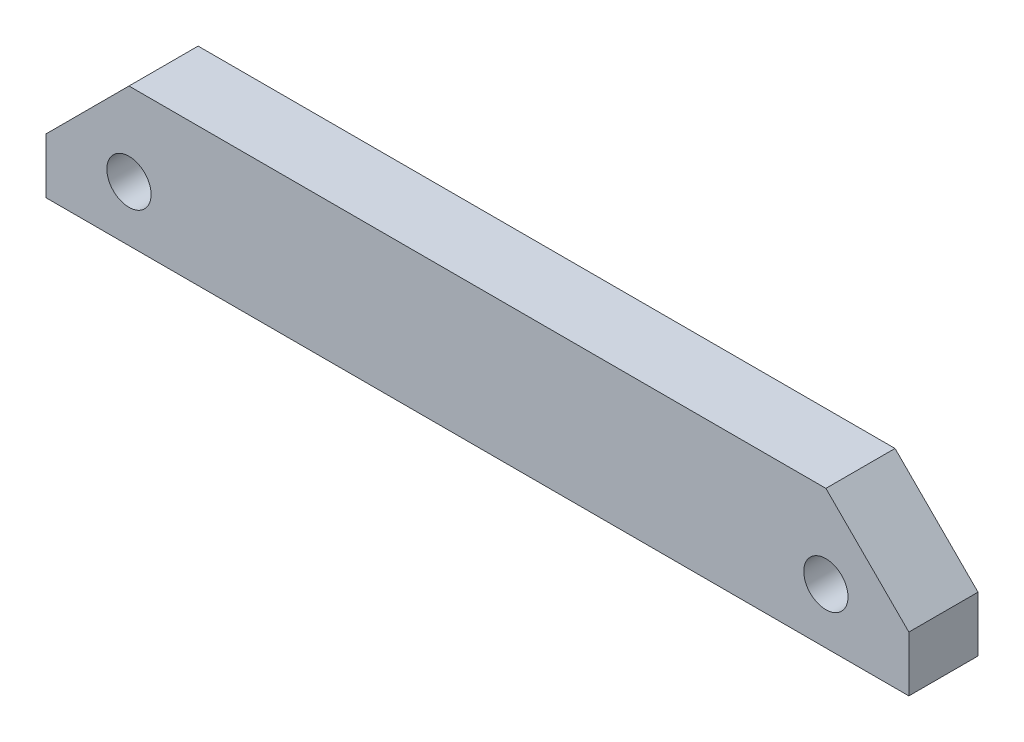
ISO-10303-21;
HEADER;
FILE_DESCRIPTION(('STEP AP214'),'2;1');
FILE_NAME('part.step','',(''),(''),'','','');
FILE_SCHEMA(('AUTOMOTIVE_DESIGN { 1 0 10303 214 1 1 1 1 }'));
ENDSEC;
DATA;
#1=APPLICATION_CONTEXT('core data for automotive mechanical design processes');
#2=APPLICATION_PROTOCOL_DEFINITION('international standard','automotive_design',2000,#1);
#3=PRODUCT_CONTEXT('',#1,'mechanical');
#4=PRODUCT('Part','Part','',(#3));
#5=PRODUCT_RELATED_PRODUCT_CATEGORY('part','',(#4));
#6=PRODUCT_DEFINITION_FORMATION('','',#4);
#7=PRODUCT_DEFINITION_CONTEXT('part definition',#1,'design');
#8=PRODUCT_DEFINITION('design','',#6,#7);
#9=PRODUCT_DEFINITION_SHAPE('','',#8);
#10=(LENGTH_UNIT() NAMED_UNIT(*) SI_UNIT(.MILLI.,.METRE.));
#11=(NAMED_UNIT(*) PLANE_ANGLE_UNIT() SI_UNIT($,.RADIAN.));
#12=(NAMED_UNIT(*) SI_UNIT($,.STERADIAN.) SOLID_ANGLE_UNIT());
#13=UNCERTAINTY_MEASURE_WITH_UNIT(LENGTH_MEASURE(1.E-05),#10,'distance_accuracy_value','');
#14=(GEOMETRIC_REPRESENTATION_CONTEXT(3) GLOBAL_UNCERTAINTY_ASSIGNED_CONTEXT((#13)) GLOBAL_UNIT_ASSIGNED_CONTEXT((#10,
#11,#12)) REPRESENTATION_CONTEXT('',''));
#15=CARTESIAN_POINT('',(0.,0.,0.));
#16=DIRECTION('',(0.,0.,1.));
#17=DIRECTION('',(1.,0.,0.));
#18=AXIS2_PLACEMENT_3D('',#15,#16,#17);
#19=CARTESIAN_POINT('',(31.2,0.,5.));
#20=DIRECTION('',(-1.,0.,0.));
#21=DIRECTION('',(0.,0.,1.));
#22=AXIS2_PLACEMENT_3D('',#19,#20,#21);
#23=PLANE('',#22);
#24=DIRECTION('',(0.,1.,0.));
#25=VECTOR('',#24,1.);
#26=CARTESIAN_POINT('',(31.2,0.,0.));
#27=LINE('',#26,#25);
#28=CARTESIAN_POINT('',(31.2,0.,0.));
#29=VERTEX_POINT('',#28);
#30=CARTESIAN_POINT('',(31.2,4.00000000000001,0.));
#31=VERTEX_POINT('',#30);
#32=EDGE_CURVE('E128',#29,#31,#27,.T.);
#33=ORIENTED_EDGE('',*,*,#32,.T.);
#34=DIRECTION('',(0.,0.,-1.));
#35=VECTOR('',#34,1.);
#36=CARTESIAN_POINT('',(31.2,4.00000000000001,5.));
#37=LINE('',#36,#35);
#38=CARTESIAN_POINT('',(31.2,4.00000000000001,5.));
#39=VERTEX_POINT('',#38);
#40=EDGE_CURVE('E11',#39,#31,#37,.T.);
#41=ORIENTED_EDGE('',*,*,#40,.F.);
#42=DIRECTION('',(0.,1.,0.));
#43=VECTOR('',#42,1.);
#44=CARTESIAN_POINT('',(31.2,0.,5.));
#45=LINE('',#44,#43);
#46=CARTESIAN_POINT('',(31.2,0.,5.));
#47=VERTEX_POINT('',#46);
#48=EDGE_CURVE('E145',#47,#39,#45,.T.);
#49=ORIENTED_EDGE('',*,*,#48,.F.);
#50=DIRECTION('',(0.,0.,-1.));
#51=VECTOR('',#50,1.);
#52=CARTESIAN_POINT('',(31.2,0.,5.));
#53=LINE('',#52,#51);
#54=EDGE_CURVE('E124',#47,#29,#53,.T.);
#55=ORIENTED_EDGE('',*,*,#54,.T.);
#56=EDGE_LOOP('',(#33,#41,#49,#55));
#57=FACE_BOUND('',#56,.T.);
#58=ADVANCED_FACE('F39',(#57),#23,.F.);
#59=CARTESIAN_POINT('',(31.2,4.00000000000001,5.));
#60=DIRECTION('',(-0.707106781186544,-0.707106781186551,0.));
#61=DIRECTION('',(0.707106781186551,-0.707106781186544,0.));
#62=AXIS2_PLACEMENT_3D('',#59,#60,#61);
#63=PLANE('',#62);
#64=DIRECTION('',(-0.707106781186551,0.707106781186544,0.));
#65=VECTOR('',#64,1.);
#66=CARTESIAN_POINT('',(31.2,4.00000000000001,0.));
#67=LINE('',#66,#65);
#68=CARTESIAN_POINT('',(25.1999999999999,10.,0.));
#69=VERTEX_POINT('',#68);
#70=EDGE_CURVE('E132',#31,#69,#67,.T.);
#71=ORIENTED_EDGE('',*,*,#70,.T.);
#72=DIRECTION('',(0.,0.,-1.));
#73=VECTOR('',#72,1.);
#74=CARTESIAN_POINT('',(25.1999999999999,10.,5.));
#75=LINE('',#74,#73);
#76=CARTESIAN_POINT('',(25.1999999999999,10.,5.));
#77=VERTEX_POINT('',#76);
#78=EDGE_CURVE('E48',#77,#69,#75,.T.);
#79=ORIENTED_EDGE('',*,*,#78,.F.);
#80=DIRECTION('',(-0.707106781186551,0.707106781186544,0.));
#81=VECTOR('',#80,1.);
#82=CARTESIAN_POINT('',(31.2,4.00000000000001,5.));
#83=LINE('',#82,#81);
#84=EDGE_CURVE('E93',#39,#77,#83,.T.);
#85=ORIENTED_EDGE('',*,*,#84,.F.);
#86=ORIENTED_EDGE('',*,*,#40,.T.);
#87=EDGE_LOOP('',(#71,#79,#85,#86));
#88=FACE_BOUND('',#87,.T.);
#89=ADVANCED_FACE('F174',(#88),#63,.F.);
#90=CARTESIAN_POINT('',(25.1999999999999,10.,5.));
#91=DIRECTION('',(0.,-1.,0.));
#92=DIRECTION('',(1.,0.,0.));
#93=AXIS2_PLACEMENT_3D('',#90,#91,#92);
#94=PLANE('',#93);
#95=DIRECTION('',(-1.,0.,0.));
#96=VECTOR('',#95,1.);
#97=CARTESIAN_POINT('',(25.1999999999999,10.,0.));
#98=LINE('',#97,#96);
#99=CARTESIAN_POINT('',(-25.2000000000001,9.99999999999999,0.));
#100=VERTEX_POINT('',#99);
#101=EDGE_CURVE('E136',#69,#100,#98,.T.);
#102=ORIENTED_EDGE('',*,*,#101,.T.);
#103=DIRECTION('',(0.,0.,-1.));
#104=VECTOR('',#103,1.);
#105=CARTESIAN_POINT('',(-25.2000000000001,9.99999999999999,5.));
#106=LINE('',#105,#104);
#107=CARTESIAN_POINT('',(-25.2000000000001,9.99999999999999,5.));
#108=VERTEX_POINT('',#107);
#109=EDGE_CURVE('E117',#108,#100,#106,.T.);
#110=ORIENTED_EDGE('',*,*,#109,.F.);
#111=DIRECTION('',(-1.,0.,0.));
#112=VECTOR('',#111,1.);
#113=CARTESIAN_POINT('',(25.1999999999999,10.,5.));
#114=LINE('',#113,#112);
#115=EDGE_CURVE('E106',#77,#108,#114,.T.);
#116=ORIENTED_EDGE('',*,*,#115,.F.);
#117=ORIENTED_EDGE('',*,*,#78,.T.);
#118=EDGE_LOOP('',(#102,#110,#116,#117));
#119=FACE_BOUND('',#118,.T.);
#120=ADVANCED_FACE('F155',(#119),#94,.F.);
#121=CARTESIAN_POINT('',(-31.2,4.,5.));
#122=DIRECTION('',(0.707106781186551,-0.707106781186544,0.));
#123=DIRECTION('',(0.707106781186544,0.707106781186551,0.));
#124=AXIS2_PLACEMENT_3D('',#121,#122,#123);
#125=PLANE('',#124);
#126=DIRECTION('',(-0.707106781186544,-0.707106781186551,0.));
#127=VECTOR('',#126,1.);
#128=CARTESIAN_POINT('',(-31.2,4.,0.));
#129=LINE('',#128,#127);
#130=CARTESIAN_POINT('',(-31.2,4.,0.));
#131=VERTEX_POINT('',#130);
#132=EDGE_CURVE('E115',#100,#131,#129,.T.);
#133=ORIENTED_EDGE('',*,*,#132,.T.);
#134=DIRECTION('',(0.,0.,-1.));
#135=VECTOR('',#134,1.);
#136=CARTESIAN_POINT('',(-31.2,4.,5.));
#137=LINE('',#136,#135);
#138=CARTESIAN_POINT('',(-31.2,4.,5.));
#139=VERTEX_POINT('',#138);
#140=EDGE_CURVE('E112',#139,#131,#137,.T.);
#141=ORIENTED_EDGE('',*,*,#140,.F.);
#142=DIRECTION('',(-0.707106781186544,-0.707106781186551,0.));
#143=VECTOR('',#142,1.);
#144=CARTESIAN_POINT('',(-31.2,4.,5.));
#145=LINE('',#144,#143);
#146=EDGE_CURVE('E100',#108,#139,#145,.T.);
#147=ORIENTED_EDGE('',*,*,#146,.F.);
#148=ORIENTED_EDGE('',*,*,#109,.T.);
#149=EDGE_LOOP('',(#133,#141,#147,#148));
#150=FACE_BOUND('',#149,.T.);
#151=ADVANCED_FACE('F113',(#150),#125,.F.);
#152=CARTESIAN_POINT('',(-31.2,0.,5.));
#153=DIRECTION('',(1.,0.,0.));
#154=DIRECTION('',(0.,0.,-1.));
#155=AXIS2_PLACEMENT_3D('',#152,#153,#154);
#156=PLANE('',#155);
#157=DIRECTION('',(0.,-1.,0.));
#158=VECTOR('',#157,1.);
#159=CARTESIAN_POINT('',(-31.2,0.,0.));
#160=LINE('',#159,#158);
#161=CARTESIAN_POINT('',(-31.2,0.,0.));
#162=VERTEX_POINT('',#161);
#163=EDGE_CURVE('E79',#131,#162,#160,.T.);
#164=ORIENTED_EDGE('',*,*,#163,.T.);
#165=DIRECTION('',(0.,0.,-1.));
#166=VECTOR('',#165,1.);
#167=CARTESIAN_POINT('',(-31.2,0.,5.));
#168=LINE('',#167,#166);
#169=CARTESIAN_POINT('',(-31.2,0.,5.));
#170=VERTEX_POINT('',#169);
#171=EDGE_CURVE('E118',#170,#162,#168,.T.);
#172=ORIENTED_EDGE('',*,*,#171,.F.);
#173=DIRECTION('',(0.,-1.,0.));
#174=VECTOR('',#173,1.);
#175=CARTESIAN_POINT('',(-31.2,0.,5.));
#176=LINE('',#175,#174);
#177=EDGE_CURVE('E104',#139,#170,#176,.T.);
#178=ORIENTED_EDGE('',*,*,#177,.F.);
#179=ORIENTED_EDGE('',*,*,#140,.T.);
#180=EDGE_LOOP('',(#164,#172,#178,#179));
#181=FACE_BOUND('',#180,.T.);
#182=ADVANCED_FACE('F120',(#181),#156,.F.);
#183=CARTESIAN_POINT('',(-31.2,0.,5.));
#184=DIRECTION('',(0.,1.,0.));
#185=DIRECTION('',(0.,0.,1.));
#186=AXIS2_PLACEMENT_3D('',#183,#184,#185);
#187=PLANE('',#186);
#188=DIRECTION('',(1.,0.,0.));
#189=VECTOR('',#188,1.);
#190=CARTESIAN_POINT('',(-31.2,0.,0.));
#191=LINE('',#190,#189);
#192=EDGE_CURVE('E85',#162,#29,#191,.T.);
#193=ORIENTED_EDGE('',*,*,#192,.T.);
#194=ORIENTED_EDGE('',*,*,#54,.F.);
#195=DIRECTION('',(1.,0.,0.));
#196=VECTOR('',#195,1.);
#197=CARTESIAN_POINT('',(-31.2,0.,5.));
#198=LINE('',#197,#196);
#199=EDGE_CURVE('E56',#170,#47,#198,.T.);
#200=ORIENTED_EDGE('',*,*,#199,.F.);
#201=ORIENTED_EDGE('',*,*,#171,.T.);
#202=EDGE_LOOP('',(#193,#194,#200,#201));
#203=FACE_BOUND('',#202,.T.);
#204=ADVANCED_FACE('F162',(#203),#187,.F.);
#205=CARTESIAN_POINT('',(0.,0.,5.));
#206=DIRECTION('',(0.,0.,1.));
#207=DIRECTION('',(1.,0.,0.));
#208=AXIS2_PLACEMENT_3D('',#205,#206,#207);
#209=PLANE('',#208);
#210=CARTESIAN_POINT('',(-25.2,4.,5.));
#211=DIRECTION('',(0.,0.,1.));
#212=DIRECTION('',(1.,0.,0.));
#213=AXIS2_PLACEMENT_3D('',#210,#211,#212);
#214=CIRCLE('',#213,1.6);
#215=CARTESIAN_POINT('',(-23.6,4.,5.));
#216=VERTEX_POINT('',#215);
#217=EDGE_CURVE('E239',#216,#216,#214,.T.);
#218=ORIENTED_EDGE('',*,*,#217,.F.);
#219=EDGE_LOOP('',(#218));
#220=FACE_BOUND('',#219,.T.);
#221=CARTESIAN_POINT('',(25.2,4.00000000000031,5.));
#222=DIRECTION('',(0.,0.,1.));
#223=DIRECTION('',(-1.,0.,0.));
#224=AXIS2_PLACEMENT_3D('',#221,#222,#223);
#225=CIRCLE('',#224,1.6);
#226=CARTESIAN_POINT('',(23.5999999999999,4.00000000000031,5.));
#227=VERTEX_POINT('',#226);
#228=EDGE_CURVE('E247',#227,#227,#225,.T.);
#229=ORIENTED_EDGE('',*,*,#228,.F.);
#230=EDGE_LOOP('',(#229));
#231=FACE_BOUND('',#230,.T.);
#232=ORIENTED_EDGE('',*,*,#48,.T.);
#233=ORIENTED_EDGE('',*,*,#84,.T.);
#234=ORIENTED_EDGE('',*,*,#115,.T.);
#235=ORIENTED_EDGE('',*,*,#146,.T.);
#236=ORIENTED_EDGE('',*,*,#177,.T.);
#237=ORIENTED_EDGE('',*,*,#199,.T.);
#238=EDGE_LOOP('',(#232,#233,#234,#235,#236,#237));
#239=FACE_BOUND('',#238,.T.);
#240=ADVANCED_FACE('F102',(#220,#231,#239),#209,.T.);
#241=CARTESIAN_POINT('',(0.,0.,0.));
#242=DIRECTION('',(0.,0.,1.));
#243=DIRECTION('',(1.,0.,0.));
#244=AXIS2_PLACEMENT_3D('',#241,#242,#243);
#245=PLANE('',#244);
#246=CARTESIAN_POINT('',(-25.2,4.,0.));
#247=DIRECTION('',(0.,0.,1.));
#248=DIRECTION('',(1.,0.,0.));
#249=AXIS2_PLACEMENT_3D('',#246,#247,#248);
#250=CIRCLE('',#249,1.6);
#251=CARTESIAN_POINT('',(-23.6,4.,0.));
#252=VERTEX_POINT('',#251);
#253=EDGE_CURVE('E133',#252,#252,#250,.T.);
#254=ORIENTED_EDGE('',*,*,#253,.T.);
#255=EDGE_LOOP('',(#254));
#256=FACE_BOUND('',#255,.T.);
#257=CARTESIAN_POINT('',(25.2,4.00000000000031,0.));
#258=DIRECTION('',(0.,0.,1.));
#259=DIRECTION('',(-1.,0.,0.));
#260=AXIS2_PLACEMENT_3D('',#257,#258,#259);
#261=CIRCLE('',#260,1.6);
#262=CARTESIAN_POINT('',(23.5999999999999,4.00000000000031,0.));
#263=VERTEX_POINT('',#262);
#264=EDGE_CURVE('E241',#263,#263,#261,.T.);
#265=ORIENTED_EDGE('',*,*,#264,.T.);
#266=EDGE_LOOP('',(#265));
#267=FACE_BOUND('',#266,.T.);
#268=ORIENTED_EDGE('',*,*,#32,.F.);
#269=ORIENTED_EDGE('',*,*,#192,.F.);
#270=ORIENTED_EDGE('',*,*,#163,.F.);
#271=ORIENTED_EDGE('',*,*,#132,.F.);
#272=ORIENTED_EDGE('',*,*,#101,.F.);
#273=ORIENTED_EDGE('',*,*,#70,.F.);
#274=EDGE_LOOP('',(#268,#269,#270,#271,#272,#273));
#275=FACE_BOUND('',#274,.T.);
#276=ADVANCED_FACE('F158',(#256,#267,#275),#245,.F.);
#277=CARTESIAN_POINT('',(25.2,4.00000000000031,0.));
#278=DIRECTION('',(0.,0.,1.));
#279=DIRECTION('',(1.,0.,0.));
#280=AXIS2_PLACEMENT_3D('',#277,#278,#279);
#281=CYLINDRICAL_SURFACE('',#280,1.6);
#282=ORIENTED_EDGE('',*,*,#264,.F.);
#283=EDGE_LOOP('',(#282));
#284=FACE_BOUND('',#283,.T.);
#285=ORIENTED_EDGE('',*,*,#228,.T.);
#286=EDGE_LOOP('',(#285));
#287=FACE_BOUND('',#286,.T.);
#288=ADVANCED_FACE('F211',(#284,#287),#281,.F.);
#289=CARTESIAN_POINT('',(-25.2,4.,0.));
#290=DIRECTION('',(0.,0.,1.));
#291=DIRECTION('',(1.,0.,0.));
#292=AXIS2_PLACEMENT_3D('',#289,#290,#291);
#293=CYLINDRICAL_SURFACE('',#292,1.6);
#294=ORIENTED_EDGE('',*,*,#253,.F.);
#295=EDGE_LOOP('',(#294));
#296=FACE_BOUND('',#295,.T.);
#297=ORIENTED_EDGE('',*,*,#217,.T.);
#298=EDGE_LOOP('',(#297));
#299=FACE_BOUND('',#298,.T.);
#300=ADVANCED_FACE('F220',(#296,#299),#293,.F.);
#301=CLOSED_SHELL('',(#58,#89,#120,#151,#182,#204,#240,#276,#288,#300));
#302=MANIFOLD_SOLID_BREP('B2',#301);
#303=ADVANCED_BREP_SHAPE_REPRESENTATION('',(#18,#302),#14);
#304=SHAPE_DEFINITION_REPRESENTATION(#9,#303);
ENDSEC;
END-ISO-10303-21;
